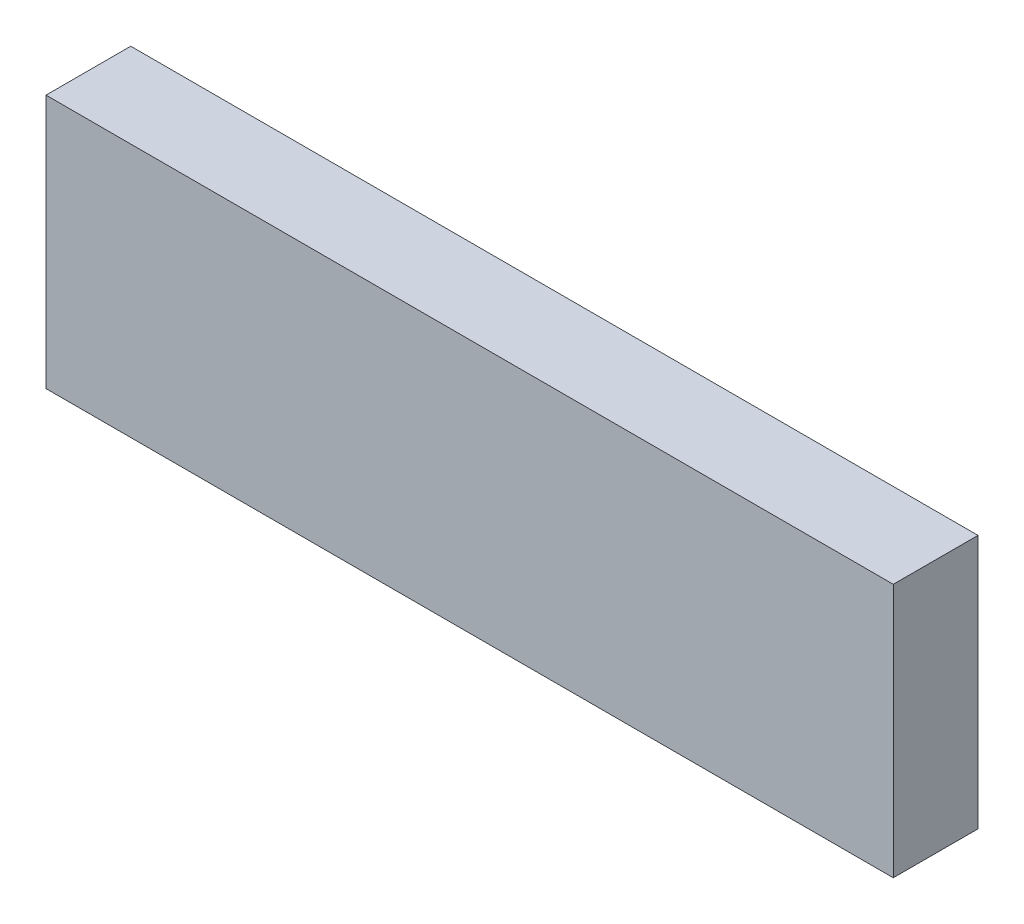
ISO-10303-21;
HEADER;
FILE_DESCRIPTION(('STEP AP214'),'2;1');
FILE_NAME('part.step','',(''),(''),'','','');
FILE_SCHEMA(('AUTOMOTIVE_DESIGN { 1 0 10303 214 1 1 1 1 }'));
ENDSEC;
DATA;
#1=APPLICATION_CONTEXT('core data for automotive mechanical design processes');
#2=APPLICATION_PROTOCOL_DEFINITION('international standard','automotive_design',2000,#1);
#3=PRODUCT_CONTEXT('',#1,'mechanical');
#4=PRODUCT('Part','Part','',(#3));
#5=PRODUCT_RELATED_PRODUCT_CATEGORY('part','',(#4));
#6=PRODUCT_DEFINITION_FORMATION('','',#4);
#7=PRODUCT_DEFINITION_CONTEXT('part definition',#1,'design');
#8=PRODUCT_DEFINITION('design','',#6,#7);
#9=PRODUCT_DEFINITION_SHAPE('','',#8);
#10=(LENGTH_UNIT() NAMED_UNIT(*) SI_UNIT(.MILLI.,.METRE.));
#11=(NAMED_UNIT(*) PLANE_ANGLE_UNIT() SI_UNIT($,.RADIAN.));
#12=(NAMED_UNIT(*) SI_UNIT($,.STERADIAN.) SOLID_ANGLE_UNIT());
#13=UNCERTAINTY_MEASURE_WITH_UNIT(LENGTH_MEASURE(1.E-05),#10,'distance_accuracy_value','');
#14=(GEOMETRIC_REPRESENTATION_CONTEXT(3) GLOBAL_UNCERTAINTY_ASSIGNED_CONTEXT((#13)) GLOBAL_UNIT_ASSIGNED_CONTEXT((#10,
#11,#12)) REPRESENTATION_CONTEXT('',''));
#15=CARTESIAN_POINT('',(0.,0.,0.));
#16=DIRECTION('',(0.,0.,1.));
#17=DIRECTION('',(1.,0.,0.));
#18=AXIS2_PLACEMENT_3D('',#15,#16,#17);
#19=CARTESIAN_POINT('',(0.,0.,12.7));
#20=DIRECTION('',(-1.,0.,0.));
#21=DIRECTION('',(0.,0.,1.));
#22=AXIS2_PLACEMENT_3D('',#19,#20,#21);
#23=PLANE('',#22);
#24=DIRECTION('',(0.,1.,0.));
#25=VECTOR('',#24,1.);
#26=CARTESIAN_POINT('',(0.,0.,0.));
#27=LINE('',#26,#25);
#28=CARTESIAN_POINT('',(0.,0.,0.));
#29=VERTEX_POINT('',#28);
#30=CARTESIAN_POINT('',(0.,38.1,0.));
#31=VERTEX_POINT('',#30);
#32=EDGE_CURVE('E96',#29,#31,#27,.T.);
#33=ORIENTED_EDGE('',*,*,#32,.T.);
#34=DIRECTION('',(0.,0.,-1.));
#35=VECTOR('',#34,1.);
#36=CARTESIAN_POINT('',(0.,38.1,12.7));
#37=LINE('',#36,#35);
#38=CARTESIAN_POINT('',(0.,38.1,12.7));
#39=VERTEX_POINT('',#38);
#40=EDGE_CURVE('E11',#39,#31,#37,.T.);
#41=ORIENTED_EDGE('',*,*,#40,.F.);
#42=DIRECTION('',(0.,1.,0.));
#43=VECTOR('',#42,1.);
#44=CARTESIAN_POINT('',(0.,0.,12.7));
#45=LINE('',#44,#43);
#46=CARTESIAN_POINT('',(0.,0.,12.7));
#47=VERTEX_POINT('',#46);
#48=EDGE_CURVE('E84',#47,#39,#45,.T.);
#49=ORIENTED_EDGE('',*,*,#48,.F.);
#50=DIRECTION('',(0.,0.,-1.));
#51=VECTOR('',#50,1.);
#52=CARTESIAN_POINT('',(0.,0.,12.7));
#53=LINE('',#52,#51);
#54=EDGE_CURVE('E92',#47,#29,#53,.T.);
#55=ORIENTED_EDGE('',*,*,#54,.T.);
#56=EDGE_LOOP('',(#33,#41,#49,#55));
#57=FACE_BOUND('',#56,.T.);
#58=ADVANCED_FACE('F33',(#57),#23,.F.);
#59=CARTESIAN_POINT('',(0.,38.1,12.7));
#60=DIRECTION('',(0.,-1.,0.));
#61=DIRECTION('',(1.,0.,0.));
#62=AXIS2_PLACEMENT_3D('',#59,#60,#61);
#63=PLANE('',#62);
#64=DIRECTION('',(-1.,0.,0.));
#65=VECTOR('',#64,1.);
#66=CARTESIAN_POINT('',(0.,38.1,0.));
#67=LINE('',#66,#65);
#68=CARTESIAN_POINT('',(-127.,38.1,0.));
#69=VERTEX_POINT('',#68);
#70=EDGE_CURVE('E88',#31,#69,#67,.T.);
#71=ORIENTED_EDGE('',*,*,#70,.T.);
#72=DIRECTION('',(0.,0.,-1.));
#73=VECTOR('',#72,1.);
#74=CARTESIAN_POINT('',(-127.,38.1,12.7));
#75=LINE('',#74,#73);
#76=CARTESIAN_POINT('',(-127.,38.1,12.7));
#77=VERTEX_POINT('',#76);
#78=EDGE_CURVE('E41',#77,#69,#75,.T.);
#79=ORIENTED_EDGE('',*,*,#78,.F.);
#80=DIRECTION('',(-1.,0.,0.));
#81=VECTOR('',#80,1.);
#82=CARTESIAN_POINT('',(0.,38.1,12.7));
#83=LINE('',#82,#81);
#84=EDGE_CURVE('E79',#39,#77,#83,.T.);
#85=ORIENTED_EDGE('',*,*,#84,.F.);
#86=ORIENTED_EDGE('',*,*,#40,.T.);
#87=EDGE_LOOP('',(#71,#79,#85,#86));
#88=FACE_BOUND('',#87,.T.);
#89=ADVANCED_FACE('F87',(#88),#63,.F.);
#90=CARTESIAN_POINT('',(-127.,0.,12.7));
#91=DIRECTION('',(1.,0.,0.));
#92=DIRECTION('',(0.,0.,-1.));
#93=AXIS2_PLACEMENT_3D('',#90,#91,#92);
#94=PLANE('',#93);
#95=DIRECTION('',(0.,-1.,0.));
#96=VECTOR('',#95,1.);
#97=CARTESIAN_POINT('',(-127.,0.,0.));
#98=LINE('',#97,#96);
#99=CARTESIAN_POINT('',(-127.,0.,0.));
#100=VERTEX_POINT('',#99);
#101=EDGE_CURVE('E66',#69,#100,#98,.T.);
#102=ORIENTED_EDGE('',*,*,#101,.T.);
#103=DIRECTION('',(0.,0.,-1.));
#104=VECTOR('',#103,1.);
#105=CARTESIAN_POINT('',(-127.,0.,12.7));
#106=LINE('',#105,#104);
#107=CARTESIAN_POINT('',(-127.,0.,12.7));
#108=VERTEX_POINT('',#107);
#109=EDGE_CURVE('E89',#108,#100,#106,.T.);
#110=ORIENTED_EDGE('',*,*,#109,.F.);
#111=DIRECTION('',(0.,-1.,0.));
#112=VECTOR('',#111,1.);
#113=CARTESIAN_POINT('',(-127.,0.,12.7));
#114=LINE('',#113,#112);
#115=EDGE_CURVE('E82',#77,#108,#114,.T.);
#116=ORIENTED_EDGE('',*,*,#115,.F.);
#117=ORIENTED_EDGE('',*,*,#78,.T.);
#118=EDGE_LOOP('',(#102,#110,#116,#117));
#119=FACE_BOUND('',#118,.T.);
#120=ADVANCED_FACE('F90',(#119),#94,.F.);
#121=CARTESIAN_POINT('',(0.,0.,12.7));
#122=DIRECTION('',(0.,1.,0.));
#123=DIRECTION('',(0.,0.,1.));
#124=AXIS2_PLACEMENT_3D('',#121,#122,#123);
#125=PLANE('',#124);
#126=DIRECTION('',(1.,0.,0.));
#127=VECTOR('',#126,1.);
#128=CARTESIAN_POINT('',(0.,0.,0.));
#129=LINE('',#128,#127);
#130=EDGE_CURVE('E72',#100,#29,#129,.T.);
#131=ORIENTED_EDGE('',*,*,#130,.T.);
#132=ORIENTED_EDGE('',*,*,#54,.F.);
#133=DIRECTION('',(1.,0.,0.));
#134=VECTOR('',#133,1.);
#135=CARTESIAN_POINT('',(0.,0.,12.7));
#136=LINE('',#135,#134);
#137=EDGE_CURVE('E49',#108,#47,#136,.T.);
#138=ORIENTED_EDGE('',*,*,#137,.F.);
#139=ORIENTED_EDGE('',*,*,#109,.T.);
#140=EDGE_LOOP('',(#131,#132,#138,#139));
#141=FACE_BOUND('',#140,.T.);
#142=ADVANCED_FACE('F103',(#141),#125,.F.);
#143=CARTESIAN_POINT('',(0.,0.,12.7));
#144=DIRECTION('',(0.,0.,1.));
#145=DIRECTION('',(1.,0.,0.));
#146=AXIS2_PLACEMENT_3D('',#143,#144,#145);
#147=PLANE('',#146);
#148=ORIENTED_EDGE('',*,*,#48,.T.);
#149=ORIENTED_EDGE('',*,*,#84,.T.);
#150=ORIENTED_EDGE('',*,*,#115,.T.);
#151=ORIENTED_EDGE('',*,*,#137,.T.);
#152=EDGE_LOOP('',(#148,#149,#150,#151));
#153=FACE_BOUND('',#152,.T.);
#154=ADVANCED_FACE('F80',(#153),#147,.T.);
#155=CARTESIAN_POINT('',(0.,0.,0.));
#156=DIRECTION('',(0.,0.,1.));
#157=DIRECTION('',(1.,0.,0.));
#158=AXIS2_PLACEMENT_3D('',#155,#156,#157);
#159=PLANE('',#158);
#160=ORIENTED_EDGE('',*,*,#32,.F.);
#161=ORIENTED_EDGE('',*,*,#130,.F.);
#162=ORIENTED_EDGE('',*,*,#101,.F.);
#163=ORIENTED_EDGE('',*,*,#70,.F.);
#164=EDGE_LOOP('',(#160,#161,#162,#163));
#165=FACE_BOUND('',#164,.T.);
#166=ADVANCED_FACE('F106',(#165),#159,.F.);
#167=CLOSED_SHELL('',(#58,#89,#120,#142,#154,#166));
#168=MANIFOLD_SOLID_BREP('B2',#167);
#169=ADVANCED_BREP_SHAPE_REPRESENTATION('',(#18,#168),#14);
#170=SHAPE_DEFINITION_REPRESENTATION(#9,#169);
ENDSEC;
END-ISO-10303-21;
